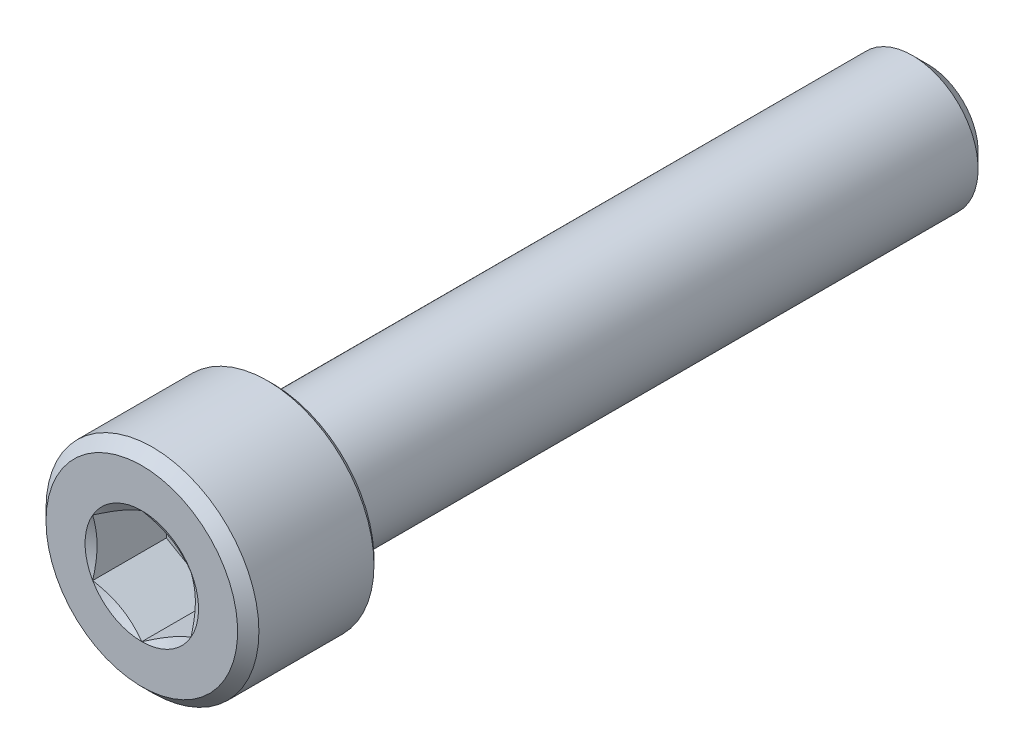
ISO-10303-21;
HEADER;
FILE_DESCRIPTION(('STEP AP214'),'2;1');
FILE_NAME('part.step','',(''),(''),'','','');
FILE_SCHEMA(('AUTOMOTIVE_DESIGN { 1 0 10303 214 1 1 1 1 }'));
ENDSEC;
DATA;
#1=APPLICATION_CONTEXT('core data for automotive mechanical design processes');
#2=APPLICATION_PROTOCOL_DEFINITION('international standard','automotive_design',2000,#1);
#3=PRODUCT_CONTEXT('',#1,'mechanical');
#4=PRODUCT('Part','Part','',(#3));
#5=PRODUCT_RELATED_PRODUCT_CATEGORY('part','',(#4));
#6=PRODUCT_DEFINITION_FORMATION('','',#4);
#7=PRODUCT_DEFINITION_CONTEXT('part definition',#1,'design');
#8=PRODUCT_DEFINITION('design','',#6,#7);
#9=PRODUCT_DEFINITION_SHAPE('','',#8);
#10=(LENGTH_UNIT() NAMED_UNIT(*) SI_UNIT(.MILLI.,.METRE.));
#11=(NAMED_UNIT(*) PLANE_ANGLE_UNIT() SI_UNIT($,.RADIAN.));
#12=(NAMED_UNIT(*) SI_UNIT($,.STERADIAN.) SOLID_ANGLE_UNIT());
#13=UNCERTAINTY_MEASURE_WITH_UNIT(LENGTH_MEASURE(1.E-05),#10,'distance_accuracy_value','');
#14=(GEOMETRIC_REPRESENTATION_CONTEXT(3) GLOBAL_UNCERTAINTY_ASSIGNED_CONTEXT((#13)) GLOBAL_UNIT_ASSIGNED_CONTEXT((#10,
#11,#12)) REPRESENTATION_CONTEXT('',''));
#15=CARTESIAN_POINT('',(0.,0.,0.));
#16=DIRECTION('',(0.,0.,1.));
#17=DIRECTION('',(1.,0.,0.));
#18=AXIS2_PLACEMENT_3D('',#15,#16,#17);
#19=CARTESIAN_POINT('',(-6.175,0.,16.));
#20=DIRECTION('',(0.,0.,-1.));
#21=DIRECTION('',(-1.,0.,0.));
#22=AXIS2_PLACEMENT_3D('',#19,#20,#21);
#23=PLANE('',#22);
#24=CARTESIAN_POINT('',(0.,0.,16.));
#25=DIRECTION('',(0.,0.,-1.));
#26=DIRECTION('',(-1.,0.,0.));
#27=AXIS2_PLACEMENT_3D('',#24,#25,#26);
#28=CIRCLE('',#27,4.);
#29=CARTESIAN_POINT('',(-4.,0.,16.));
#30=VERTEX_POINT('',#29);
#31=EDGE_CURVE('E12',#30,#30,#28,.T.);
#32=ORIENTED_EDGE('',*,*,#31,.F.);
#33=EDGE_LOOP('',(#32));
#34=FACE_BOUND('',#33,.T.);
#35=CARTESIAN_POINT('',(0.,0.,16.));
#36=DIRECTION('',(0.,0.,-1.));
#37=DIRECTION('',(-1.,0.,0.));
#38=AXIS2_PLACEMENT_3D('',#35,#36,#37);
#39=CIRCLE('',#38,6.175);
#40=CARTESIAN_POINT('',(-6.175,0.,16.));
#41=VERTEX_POINT('',#40);
#42=EDGE_CURVE('E286',#41,#41,#39,.T.);
#43=ORIENTED_EDGE('',*,*,#42,.T.);
#44=EDGE_LOOP('',(#43));
#45=FACE_BOUND('',#44,.T.);
#46=ADVANCED_FACE('F44',(#34,#45),#23,.T.);
#47=CARTESIAN_POINT('',(0.,0.,19.5));
#48=DIRECTION('',(0.,0.,1.));
#49=DIRECTION('',(1.,0.,0.));
#50=AXIS2_PLACEMENT_3D('',#47,#48,#49);
#51=PLANE('',#50);
#52=DIRECTION('',(-0.866025403784439,0.5,0.));
#53=VECTOR('',#52,1.);
#54=CARTESIAN_POINT('',(3.,1.73205080756887,19.5));
#55=LINE('',#54,#53);
#56=CARTESIAN_POINT('',(3.,1.73205080756887,19.5));
#57=VERTEX_POINT('',#56);
#58=CARTESIAN_POINT('',(0.,3.46410161513775,19.5));
#59=VERTEX_POINT('',#58);
#60=EDGE_CURVE('E113',#57,#59,#55,.T.);
#61=ORIENTED_EDGE('',*,*,#60,.T.);
#62=DIRECTION('',(-0.866025403784438,-0.5,0.));
#63=VECTOR('',#62,1.);
#64=CARTESIAN_POINT('',(0.,3.46410161513775,19.5));
#65=LINE('',#64,#63);
#66=CARTESIAN_POINT('',(-3.,1.73205080756887,19.5));
#67=VERTEX_POINT('',#66);
#68=EDGE_CURVE('E239',#59,#67,#65,.T.);
#69=ORIENTED_EDGE('',*,*,#68,.T.);
#70=DIRECTION('',(0.,-1.,0.));
#71=VECTOR('',#70,1.);
#72=CARTESIAN_POINT('',(-3.,1.73205080756887,19.5));
#73=LINE('',#72,#71);
#74=CARTESIAN_POINT('',(-3.,-1.73205080756888,19.5));
#75=VERTEX_POINT('',#74);
#76=EDGE_CURVE('E244',#67,#75,#73,.T.);
#77=ORIENTED_EDGE('',*,*,#76,.T.);
#78=DIRECTION('',(0.866025403784439,-0.5,0.));
#79=VECTOR('',#78,1.);
#80=CARTESIAN_POINT('',(-3.,-1.73205080756888,19.5));
#81=LINE('',#80,#79);
#82=CARTESIAN_POINT('',(0.,-3.46410161513776,19.5));
#83=VERTEX_POINT('',#82);
#84=EDGE_CURVE('E246',#75,#83,#81,.T.);
#85=ORIENTED_EDGE('',*,*,#84,.T.);
#86=DIRECTION('',(0.866025403784439,0.5,0.));
#87=VECTOR('',#86,1.);
#88=CARTESIAN_POINT('',(0.,-3.46410161513776,19.5));
#89=LINE('',#88,#87);
#90=CARTESIAN_POINT('',(3.,-1.73205080756888,19.5));
#91=VERTEX_POINT('',#90);
#92=EDGE_CURVE('E252',#83,#91,#89,.T.);
#93=ORIENTED_EDGE('',*,*,#92,.T.);
#94=DIRECTION('',(0.,1.,0.));
#95=VECTOR('',#94,1.);
#96=CARTESIAN_POINT('',(3.,-1.73205080756888,19.5));
#97=LINE('',#96,#95);
#98=EDGE_CURVE('E241',#91,#57,#97,.T.);
#99=ORIENTED_EDGE('',*,*,#98,.T.);
#100=EDGE_LOOP('',(#61,#69,#77,#85,#93,#99));
#101=FACE_BOUND('',#100,.T.);
#102=ADVANCED_FACE('F228',(#101),#51,.T.);
#103=CARTESIAN_POINT('',(0.,3.46410161513775,19.5));
#104=DIRECTION('',(-0.5,0.866025403784438,0.));
#105=DIRECTION('',(-0.866025403784439,-0.5,0.));
#106=AXIS2_PLACEMENT_3D('',#103,#104,#105);
#107=PLANE('',#106);
#108=DIRECTION('',(0.,0.,1.));
#109=VECTOR('',#108,1.);
#110=CARTESIAN_POINT('',(0.,3.46410161513775,19.5));
#111=LINE('',#110,#109);
#112=CARTESIAN_POINT('',(0.,3.46410161513775,24.));
#113=VERTEX_POINT('',#112);
#114=EDGE_CURVE('E67',#59,#113,#111,.T.);
#115=ORIENTED_EDGE('',*,*,#114,.T.);
#116=CARTESIAN_POINT('',(0.00019999999999905,3.46421708519159,24.0000666699999));
#117=CARTESIAN_POINT('',(-0.131635206588333,3.38810199317915,23.9561045120212));
#118=CARTESIAN_POINT('',(-0.26460840535525,3.31132988107606,23.9161223938615));
#119=CARTESIAN_POINT('',(-0.532857420002056,3.15645624025987,23.8463328880144));
#120=CARTESIAN_POINT('',(-0.668138002634341,3.07835195946099,23.8165501898343));
#121=CARTESIAN_POINT('',(-0.937022602096482,2.92311136358058,23.7701886467801));
#122=CARTESIAN_POINT('',(-1.07058524542946,2.84599893549861,23.7533012486918));
#123=CARTESIAN_POINT('',(-1.33833905729569,2.69141120014109,23.7331404500174));
#124=CARTESIAN_POINT('',(-1.47252925247984,2.61393645482891,23.72985035535));
#125=CARTESIAN_POINT('',(-1.72327559769581,2.46916798492016,23.7366913384543));
#126=CARTESIAN_POINT('',(-1.83986926497267,2.40185259973206,23.7451427217615));
#127=CARTESIAN_POINT('',(-2.07229698497464,2.26766039302179,23.7719297505759));
#128=CARTESIAN_POINT('',(-2.18813023365133,2.2007840357172,23.7902745484306));
#129=CARTESIAN_POINT('',(-2.42103725705637,2.06631510305814,23.8361355584222));
#130=CARTESIAN_POINT('',(-2.53808155051394,1.9987395487233,23.863846192832));
#131=CARTESIAN_POINT('',(-2.77042435049912,1.86459637060759,23.9267386027063));
#132=CARTESIAN_POINT('',(-2.88572583417111,1.7980270279716,23.9619055985904));
#133=CARTESIAN_POINT('',(-3.0002,1.73193533751503,24.0000666699999));
#134=B_SPLINE_CURVE_WITH_KNOTS('',3,(#116,#117,#118,#119,#120,#121,#122,#123,#124,#125,#126,
#127,#128,#129,#130,#131,#132,#133),.UNSPECIFIED.,.F.,.F.,(4,2,2,2,2,2,2,2,4),(0.,
0.47553983010304,0.952222784107962,1.41710776961288,1.88142182298026,2.28572436316091,
2.69040156475039,3.10405572063576,3.5168974940707),.UNSPECIFIED.);
#135=CARTESIAN_POINT('',(-3.,1.73205080756887,24.));
#136=VERTEX_POINT('',#135);
#137=EDGE_CURVE('E128',#113,#136,#134,.T.);
#138=ORIENTED_EDGE('',*,*,#137,.T.);
#139=DIRECTION('',(0.,0.,1.));
#140=VECTOR('',#139,1.);
#141=CARTESIAN_POINT('',(-3.,1.73205080756887,19.5));
#142=LINE('',#141,#140);
#143=EDGE_CURVE('E266',#67,#136,#142,.T.);
#144=ORIENTED_EDGE('',*,*,#143,.F.);
#145=ORIENTED_EDGE('',*,*,#68,.F.);
#146=EDGE_LOOP('',(#115,#138,#144,#145));
#147=FACE_BOUND('',#146,.T.);
#148=ADVANCED_FACE('F166',(#147),#107,.F.);
#149=CARTESIAN_POINT('',(-3.,1.73205080756887,19.5));
#150=DIRECTION('',(-1.,0.,0.));
#151=DIRECTION('',(0.,0.,1.));
#152=AXIS2_PLACEMENT_3D('',#149,#150,#151);
#153=PLANE('',#152);
#154=ORIENTED_EDGE('',*,*,#143,.T.);
#155=CARTESIAN_POINT('',(-3.,-4.48543536430121,25.1155058662184));
#156=CARTESIAN_POINT('',(-3.,-4.35588503052372,25.0533525182944));
#157=CARTESIAN_POINT('',(-3.,-4.22601909443386,24.9918447447347));
#158=CARTESIAN_POINT('',(-3.,-3.96548781431074,24.8704865718959));
#159=CARTESIAN_POINT('',(-3.,-3.83482233153596,24.8106364708305));
#160=CARTESIAN_POINT('',(-3.,-3.57177454799303,24.6926255104394));
#161=CARTESIAN_POINT('',(-3.,-3.43938664101575,24.6344771004077));
#162=CARTESIAN_POINT('',(-3.,-3.17349991024781,24.520787798694));
#163=CARTESIAN_POINT('',(-3.,-3.04000114460963,24.4652467715162));
#164=CARTESIAN_POINT('',(-3.,-2.76816374587128,24.3560522509139));
#165=CARTESIAN_POINT('',(-3.,-2.62978983048177,24.3024860760812));
#166=CARTESIAN_POINT('',(-3.,-2.35136827488079,24.1998072680353));
#167=CARTESIAN_POINT('',(-3.,-2.21132044281272,24.1506951509745));
#168=CARTESIAN_POINT('',(-3.,-1.92964550767154,24.0583268622198));
#169=CARTESIAN_POINT('',(-3.,-1.78802281189449,24.0150573953561));
#170=CARTESIAN_POINT('',(-3.,-1.5027602167832,23.9358603432606));
#171=CARTESIAN_POINT('',(-3.,-1.35912101283448,23.8999302904458));
#172=CARTESIAN_POINT('',(-3.,-1.07010604955885,23.8373211034103));
#173=CARTESIAN_POINT('',(-3.,-0.924734399405721,23.8106233691255));
#174=CARTESIAN_POINT('',(-3.,-0.632364701988075,23.7682292216072));
#175=CARTESIAN_POINT('',(-3.,-0.485366765313103,23.7525320649347));
#176=CARTESIAN_POINT('',(-3.,-0.192319677834093,23.7335954615372));
#177=CARTESIAN_POINT('',(-3.,-0.0462802617997357,23.7302090054289));
#178=CARTESIAN_POINT('',(-3.,0.245570293408266,23.7358029447781));
#179=CARTESIAN_POINT('',(-3.,0.391381417887333,23.7447841059913));
#180=CARTESIAN_POINT('',(-3.,0.643869100206319,23.7704392120639));
#181=CARTESIAN_POINT('',(-3.,0.750824764599158,23.7844927929994));
#182=CARTESIAN_POINT('',(-3.,0.963840268009906,23.818287437899));
#183=CARTESIAN_POINT('',(-3.,1.0698999603482,23.8380294152245));
#184=CARTESIAN_POINT('',(-3.,1.38665295522135,23.9047377007723));
#185=CARTESIAN_POINT('',(-3.,1.59578522307218,23.9591709581129));
#186=CARTESIAN_POINT('',(-3.,1.90847552506548,24.0521590645329));
#187=CARTESIAN_POINT('',(-3.,2.01368216267853,24.0854739198792));
#188=CARTESIAN_POINT('',(-3.,2.22307230618481,24.1552056022892));
#189=CARTESIAN_POINT('',(-3.,2.32725580472756,24.1916224516203));
#190=CARTESIAN_POINT('',(-3.,2.53464131390266,24.2670037780272));
#191=CARTESIAN_POINT('',(-3.,2.63784370218627,24.3059672252737));
#192=CARTESIAN_POINT('',(-3.,2.84341663884662,24.3860193804702));
#193=CARTESIAN_POINT('',(-3.,2.94578720091149,24.4271080533663));
#194=CARTESIAN_POINT('',(-3.,3.20710093082002,24.5346253511179));
#195=CARTESIAN_POINT('',(-3.,3.36552117789503,24.6023232629073));
#196=CARTESIAN_POINT('',(-3.,3.68093440750302,24.7409758527862));
#197=CARTESIAN_POINT('',(-3.,3.83792728242573,24.8119307740238));
#198=CARTESIAN_POINT('',(-3.,4.15079104589422,24.9563624607769));
#199=CARTESIAN_POINT('',(-3.,4.30666165721334,25.0298398251769));
#200=CARTESIAN_POINT('',(-3.,4.61746411737967,25.1787569256157));
#201=CARTESIAN_POINT('',(-3.,4.77239594525259,25.254196705301));
#202=CARTESIAN_POINT('',(-3.,5.23641467810939,25.4830040052947));
#203=CARTESIAN_POINT('',(-3.,5.54435835776794,25.638687771954));
#204=CARTESIAN_POINT('',(-3.,6.15813200085481,25.9540341937554));
#205=CARTESIAN_POINT('',(-3.,6.46396226135484,26.113696274533));
#206=CARTESIAN_POINT('',(-3.,7.04536657630952,26.4205840642052));
#207=CARTESIAN_POINT('',(-3.,7.32107199161348,26.5675613073177));
#208=CARTESIAN_POINT('',(-3.,7.87159754257052,26.8631899454703));
#209=CARTESIAN_POINT('',(-3.,8.14641764003882,27.0118414115106));
#210=CARTESIAN_POINT('',(-3.,8.6946763757738,27.3100196567772));
#211=CARTESIAN_POINT('',(-3.,8.96811674986234,27.459543247899));
#212=CARTESIAN_POINT('',(-3.,9.51444318928409,27.7595628050342));
#213=CARTESIAN_POINT('',(-3.,9.78732928570884,27.910058714409));
#214=CARTESIAN_POINT('',(-3.,10.060016784465,28.0609113094681));
#215=B_SPLINE_CURVE_WITH_KNOTS('',3,(#155,#156,#157,#158,#159,#160,#161,#162,#163,#164,#165,
#166,#167,#168,#169,#170,#171,#172,#173,#174,#175,#176,#177,#178,#179,#180,#181,#182,#183,#184,
#185,#186,#187,#188,#189,#190,#191,#192,#193,#194,#195,#196,#197,#198,#199,#200,#201,#202,#203,
#204,#205,#206,#207,#208,#209,#210,#211,#212,#213,#214),.UNSPECIFIED.,.F.,.F.,(4,2,2,2,2,2,2,2,
2,2,2,2,2,2,2,2,2,2,2,2,2,2,2,2,2,2,2,2,2,4),(0.,0.431071028294052,0.862219108681132,
1.29598254903029,1.72972342333,2.1748047551426,2.61993759885483,3.06403981300425,
3.50799246897818,3.95104542409342,4.39406843400064,4.83178333591775,5.26952534069158,
5.5929904594199,5.91650754452737,6.56394740096527,6.89499029059895,7.226035556789,
7.55694776874827,7.88785452430648,8.40463803639825,8.92146019125859,9.4384059116569,
9.95536313937712,10.9904914654607,12.0254712022289,12.9627691362888,13.9001069698815,
14.8350606497885,15.7699603501892),.UNSPECIFIED.);
#216=CARTESIAN_POINT('',(-3.,-1.73205080756888,24.));
#217=VERTEX_POINT('',#216);
#218=EDGE_CURVE('E136',#136,#217,#215,.F.);
#219=ORIENTED_EDGE('',*,*,#218,.T.);
#220=DIRECTION('',(0.,0.,1.));
#221=VECTOR('',#220,1.);
#222=CARTESIAN_POINT('',(-3.,-1.73205080756888,19.5));
#223=LINE('',#222,#221);
#224=EDGE_CURVE('E263',#75,#217,#223,.T.);
#225=ORIENTED_EDGE('',*,*,#224,.F.);
#226=ORIENTED_EDGE('',*,*,#76,.F.);
#227=EDGE_LOOP('',(#154,#219,#225,#226));
#228=FACE_BOUND('',#227,.T.);
#229=ADVANCED_FACE('F161',(#228),#153,.F.);
#230=CARTESIAN_POINT('',(-3.,-1.73205080756888,19.5));
#231=DIRECTION('',(-0.5,-0.866025403784439,0.));
#232=DIRECTION('',(0.866025403784439,-0.5,0.));
#233=AXIS2_PLACEMENT_3D('',#230,#231,#232);
#234=PLANE('',#233);
#235=ORIENTED_EDGE('',*,*,#224,.T.);
#236=CARTESIAN_POINT('',(-3.0002,-1.73193533751504,24.0000666699999));
#237=CARTESIAN_POINT('',(-2.86836479341167,-1.80805042952749,23.9561045120212));
#238=CARTESIAN_POINT('',(-2.73539159464475,-1.88482254163057,23.9161223938615));
#239=CARTESIAN_POINT('',(-2.46714257999794,-2.03969618244676,23.8463328880144));
#240=CARTESIAN_POINT('',(-2.33186199736566,-2.11780046324564,23.8165501898343));
#241=CARTESIAN_POINT('',(-2.06297739790352,-2.27304105912605,23.7701886467801));
#242=CARTESIAN_POINT('',(-1.92941475457054,-2.35015348720802,23.7533012486918));
#243=CARTESIAN_POINT('',(-1.66166094270431,-2.50474122256554,23.7331404500174));
#244=CARTESIAN_POINT('',(-1.52747074752016,-2.58221596787772,23.72985035535));
#245=CARTESIAN_POINT('',(-1.27672440230419,-2.72698443778647,23.7366913384543));
#246=CARTESIAN_POINT('',(-1.16013073502732,-2.79429982297457,23.7451427217615));
#247=CARTESIAN_POINT('',(-0.927703015025363,-2.92849202968484,23.7719297505759));
#248=CARTESIAN_POINT('',(-0.811869766348668,-2.99536838698943,23.7902745484306));
#249=CARTESIAN_POINT('',(-0.578962742943631,-3.12983731964849,23.8361355584222));
#250=CARTESIAN_POINT('',(-0.461918449486057,-3.19741287398333,23.863846192832));
#251=CARTESIAN_POINT('',(-0.229575649500873,-3.33155605209904,23.9267386027063));
#252=CARTESIAN_POINT('',(-0.114274165828892,-3.39812539473503,23.9619055985904));
#253=CARTESIAN_POINT('',(0.000200000000001612,-3.4642170851916,24.0000666699999));
#254=B_SPLINE_CURVE_WITH_KNOTS('',3,(#236,#237,#238,#239,#240,#241,#242,#243,#244,#245,#246,
#247,#248,#249,#250,#251,#252,#253),.UNSPECIFIED.,.F.,.F.,(4,2,2,2,2,2,2,2,4),(0.,
0.475539830103041,0.952222784107963,1.41710776961288,1.88142182298026,2.28572436316091,
2.69040156475039,3.10405572063576,3.5168974940707),.UNSPECIFIED.);
#255=CARTESIAN_POINT('',(0.,-3.46410161513776,24.));
#256=VERTEX_POINT('',#255);
#257=EDGE_CURVE('E141',#217,#256,#254,.T.);
#258=ORIENTED_EDGE('',*,*,#257,.T.);
#259=DIRECTION('',(0.,0.,1.));
#260=VECTOR('',#259,1.);
#261=CARTESIAN_POINT('',(0.,-3.46410161513776,19.5));
#262=LINE('',#261,#260);
#263=EDGE_CURVE('E259',#83,#256,#262,.T.);
#264=ORIENTED_EDGE('',*,*,#263,.F.);
#265=ORIENTED_EDGE('',*,*,#84,.F.);
#266=EDGE_LOOP('',(#235,#258,#264,#265));
#267=FACE_BOUND('',#266,.T.);
#268=ADVANCED_FACE('F165',(#267),#234,.F.);
#269=CARTESIAN_POINT('',(0.,-3.46410161513776,19.5));
#270=DIRECTION('',(0.5,-0.866025403784438,0.));
#271=DIRECTION('',(0.866025403784439,0.5,0.));
#272=AXIS2_PLACEMENT_3D('',#269,#270,#271);
#273=PLANE('',#272);
#274=ORIENTED_EDGE('',*,*,#263,.T.);
#275=CARTESIAN_POINT('',(-0.000199999999998245,-3.4642170851916,24.0000666699999));
#276=CARTESIAN_POINT('',(0.131635206588334,-3.38810199317915,23.9561045120212));
#277=CARTESIAN_POINT('',(0.264608405355251,-3.31132988107607,23.9161223938615));
#278=CARTESIAN_POINT('',(0.532857420002058,-3.15645624025988,23.8463328880144));
#279=CARTESIAN_POINT('',(0.668138002634344,-3.078351959461,23.8165501898343));
#280=CARTESIAN_POINT('',(0.937022602096485,-2.92311136358059,23.7701886467801));
#281=CARTESIAN_POINT('',(1.07058524542946,-2.84599893549862,23.7533012486918));
#282=CARTESIAN_POINT('',(1.33833905729569,-2.6914112001411,23.7331404500174));
#283=CARTESIAN_POINT('',(1.47252925247984,-2.61393645482892,23.72985035535));
#284=CARTESIAN_POINT('',(1.72327559769581,-2.46916798492017,23.7366913384543));
#285=CARTESIAN_POINT('',(1.83986926497268,-2.40185259973206,23.7451427217615));
#286=CARTESIAN_POINT('',(2.07229698497464,-2.2676603930218,23.7719297505759));
#287=CARTESIAN_POINT('',(2.18813023365133,-2.2007840357172,23.7902745484306));
#288=CARTESIAN_POINT('',(2.42103725705637,-2.06631510305815,23.8361355584222));
#289=CARTESIAN_POINT('',(2.53808155051394,-1.99873954872331,23.863846192832));
#290=CARTESIAN_POINT('',(2.77042435049912,-1.86459637060759,23.9267386027063));
#291=CARTESIAN_POINT('',(2.88572583417111,-1.79802702797161,23.9619055985904));
#292=CARTESIAN_POINT('',(3.0002,-1.73193533751504,24.0000666699999));
#293=B_SPLINE_CURVE_WITH_KNOTS('',3,(#275,#276,#277,#278,#279,#280,#281,#282,#283,#284,#285,
#286,#287,#288,#289,#290,#291,#292),.UNSPECIFIED.,.F.,.F.,(4,2,2,2,2,2,2,2,4),(0.,
0.475539830103042,0.952222784107964,1.41710776961288,1.88142182298026,2.28572436316091,
2.69040156475039,3.10405572063576,3.5168974940707),.UNSPECIFIED.);
#294=CARTESIAN_POINT('',(3.,-1.73205080756888,24.));
#295=VERTEX_POINT('',#294);
#296=EDGE_CURVE('E122',#256,#295,#293,.T.);
#297=ORIENTED_EDGE('',*,*,#296,.T.);
#298=DIRECTION('',(0.,0.,1.));
#299=VECTOR('',#298,1.);
#300=CARTESIAN_POINT('',(3.,-1.73205080756888,19.5));
#301=LINE('',#300,#299);
#302=EDGE_CURVE('E119',#91,#295,#301,.T.);
#303=ORIENTED_EDGE('',*,*,#302,.F.);
#304=ORIENTED_EDGE('',*,*,#92,.F.);
#305=EDGE_LOOP('',(#274,#297,#303,#304));
#306=FACE_BOUND('',#305,.T.);
#307=ADVANCED_FACE('F172',(#306),#273,.F.);
#308=CARTESIAN_POINT('',(3.,-1.73205080756888,19.5));
#309=DIRECTION('',(1.,0.,0.));
#310=DIRECTION('',(0.,0.,-1.));
#311=AXIS2_PLACEMENT_3D('',#308,#309,#310);
#312=PLANE('',#311);
#313=ORIENTED_EDGE('',*,*,#302,.T.);
#314=CARTESIAN_POINT('',(3.,-4.48543536430121,25.1155058662184));
#315=CARTESIAN_POINT('',(3.,-4.35588503052372,25.0533525182944));
#316=CARTESIAN_POINT('',(3.,-4.22601909443386,24.9918447447347));
#317=CARTESIAN_POINT('',(3.,-3.96548781431074,24.8704865718959));
#318=CARTESIAN_POINT('',(3.,-3.83482233153596,24.8106364708305));
#319=CARTESIAN_POINT('',(3.,-3.57177454799303,24.6926255104394));
#320=CARTESIAN_POINT('',(3.,-3.43938664101575,24.6344771004077));
#321=CARTESIAN_POINT('',(3.,-3.1734999102478,24.520787798694));
#322=CARTESIAN_POINT('',(3.,-3.04000114460963,24.4652467715162));
#323=CARTESIAN_POINT('',(3.,-2.76816374587128,24.3560522509139));
#324=CARTESIAN_POINT('',(3.,-2.62978983048177,24.3024860760812));
#325=CARTESIAN_POINT('',(3.,-2.35136827488079,24.1998072680353));
#326=CARTESIAN_POINT('',(3.,-2.21132044281271,24.1506951509745));
#327=CARTESIAN_POINT('',(3.,-1.92964550767154,24.0583268622198));
#328=CARTESIAN_POINT('',(3.,-1.78802281189448,24.0150573953561));
#329=CARTESIAN_POINT('',(3.,-1.5027602167832,23.9358603432606));
#330=CARTESIAN_POINT('',(3.,-1.35912101283448,23.8999302904458));
#331=CARTESIAN_POINT('',(3.,-1.07010604955885,23.8373211034103));
#332=CARTESIAN_POINT('',(3.,-0.92473439940572,23.8106233691255));
#333=CARTESIAN_POINT('',(3.,-0.632364701988074,23.7682292216072));
#334=CARTESIAN_POINT('',(3.,-0.485366765313101,23.7525320649347));
#335=CARTESIAN_POINT('',(3.,-0.192319677834091,23.7335954615372));
#336=CARTESIAN_POINT('',(3.,-0.0462802617997347,23.7302090054289));
#337=CARTESIAN_POINT('',(3.,0.245570293408267,23.7358029447781));
#338=CARTESIAN_POINT('',(3.,0.391381417887334,23.7447841059913));
#339=CARTESIAN_POINT('',(3.,0.64386910020632,23.7704392120639));
#340=CARTESIAN_POINT('',(3.,0.750824764599159,23.7844927929994));
#341=CARTESIAN_POINT('',(3.,0.963840268009907,23.818287437899));
#342=CARTESIAN_POINT('',(3.,1.0698999603482,23.8380294152245));
#343=CARTESIAN_POINT('',(3.,1.38665295522135,23.9047377007723));
#344=CARTESIAN_POINT('',(3.,1.59578522307218,23.9591709581129));
#345=CARTESIAN_POINT('',(3.,1.90847552506548,24.0521590645329));
#346=CARTESIAN_POINT('',(3.,2.01368216267853,24.0854739198792));
#347=CARTESIAN_POINT('',(3.,2.22307230618481,24.1552056022892));
#348=CARTESIAN_POINT('',(3.,2.32725580472756,24.1916224516203));
#349=CARTESIAN_POINT('',(3.,2.53464131390266,24.2670037780272));
#350=CARTESIAN_POINT('',(3.,2.63784370218627,24.3059672252737));
#351=CARTESIAN_POINT('',(3.,2.84341663884662,24.3860193804702));
#352=CARTESIAN_POINT('',(3.,2.94578720091149,24.4271080533663));
#353=CARTESIAN_POINT('',(3.,3.20710093082002,24.5346253511179));
#354=CARTESIAN_POINT('',(3.,3.36552117789503,24.6023232629073));
#355=CARTESIAN_POINT('',(3.,3.68093440750302,24.7409758527862));
#356=CARTESIAN_POINT('',(3.,3.83792728242573,24.8119307740238));
#357=CARTESIAN_POINT('',(3.,4.15079104589422,24.9563624607769));
#358=CARTESIAN_POINT('',(3.,4.30666165721334,25.0298398251769));
#359=CARTESIAN_POINT('',(3.,4.61746411737967,25.1787569256157));
#360=CARTESIAN_POINT('',(3.,4.77239594525259,25.254196705301));
#361=CARTESIAN_POINT('',(3.,5.23641467810939,25.4830040052947));
#362=CARTESIAN_POINT('',(3.,5.54435835776794,25.638687771954));
#363=CARTESIAN_POINT('',(3.,6.15813200085481,25.9540341937554));
#364=CARTESIAN_POINT('',(3.,6.46396226135485,26.113696274533));
#365=CARTESIAN_POINT('',(3.,7.04536657630953,26.4205840642052));
#366=CARTESIAN_POINT('',(3.,7.32107199161348,26.5675613073177));
#367=CARTESIAN_POINT('',(3.,7.87159754257052,26.8631899454703));
#368=CARTESIAN_POINT('',(3.,8.14641764003882,27.0118414115106));
#369=CARTESIAN_POINT('',(3.,8.6946763757738,27.3100196567772));
#370=CARTESIAN_POINT('',(3.,8.96811674986234,27.459543247899));
#371=CARTESIAN_POINT('',(3.,9.51444318928409,27.7595628050342));
#372=CARTESIAN_POINT('',(3.,9.78732928570884,27.910058714409));
#373=CARTESIAN_POINT('',(3.,10.060016784465,28.0609113094681));
#374=B_SPLINE_CURVE_WITH_KNOTS('',3,(#314,#315,#316,#317,#318,#319,#320,#321,#322,#323,#324,
#325,#326,#327,#328,#329,#330,#331,#332,#333,#334,#335,#336,#337,#338,#339,#340,#341,#342,#343,
#344,#345,#346,#347,#348,#349,#350,#351,#352,#353,#354,#355,#356,#357,#358,#359,#360,#361,#362,
#363,#364,#365,#366,#367,#368,#369,#370,#371,#372,#373),.UNSPECIFIED.,.F.,.F.,(4,2,2,2,2,2,2,2,
2,2,2,2,2,2,2,2,2,2,2,2,2,2,2,2,2,2,2,2,2,4),(0.,0.431071028294053,0.862219108681132,
1.2959825490303,1.72972342333,2.1748047551426,2.61993759885483,3.06403981300425,
3.50799246897818,3.95104542409342,4.39406843400064,4.83178333591775,5.26952534069158,
5.5929904594199,5.91650754452737,6.56394740096527,6.89499029059895,7.226035556789,
7.55694776874827,7.88785452430648,8.40463803639825,8.92146019125859,9.4384059116569,
9.95536313937712,10.9904914654607,12.0254712022289,12.9627691362888,13.9001069698815,
14.8350606497885,15.7699603501892),.UNSPECIFIED.);
#375=CARTESIAN_POINT('',(3.,1.73205080756887,24.));
#376=VERTEX_POINT('',#375);
#377=EDGE_CURVE('E103',#295,#376,#374,.T.);
#378=ORIENTED_EDGE('',*,*,#377,.T.);
#379=DIRECTION('',(0.,0.,1.));
#380=VECTOR('',#379,1.);
#381=CARTESIAN_POINT('',(3.,1.73205080756887,19.5));
#382=LINE('',#381,#380);
#383=EDGE_CURVE('E118',#57,#376,#382,.T.);
#384=ORIENTED_EDGE('',*,*,#383,.F.);
#385=ORIENTED_EDGE('',*,*,#98,.F.);
#386=EDGE_LOOP('',(#313,#378,#384,#385));
#387=FACE_BOUND('',#386,.T.);
#388=ADVANCED_FACE('F116',(#387),#312,.F.);
#389=CARTESIAN_POINT('',(3.,1.73205080756887,19.5));
#390=DIRECTION('',(0.5,0.866025403784439,0.));
#391=DIRECTION('',(-0.866025403784439,0.5,0.));
#392=AXIS2_PLACEMENT_3D('',#389,#390,#391);
#393=PLANE('',#392);
#394=ORIENTED_EDGE('',*,*,#383,.T.);
#395=CARTESIAN_POINT('',(3.0002,1.73193533751504,24.0000666699999));
#396=CARTESIAN_POINT('',(2.86836479341167,1.80805042952748,23.9561045120212));
#397=CARTESIAN_POINT('',(2.73539159464475,1.88482254163057,23.9161223938615));
#398=CARTESIAN_POINT('',(2.46714257999794,2.03969618244675,23.8463328880144));
#399=CARTESIAN_POINT('',(2.33186199736566,2.11780046324563,23.8165501898343));
#400=CARTESIAN_POINT('',(2.06297739790352,2.27304105912604,23.7701886467801));
#401=CARTESIAN_POINT('',(1.92941475457054,2.35015348720801,23.7533012486918));
#402=CARTESIAN_POINT('',(1.66166094270431,2.50474122256553,23.7331404500174));
#403=CARTESIAN_POINT('',(1.52747074752016,2.58221596787771,23.72985035535));
#404=CARTESIAN_POINT('',(1.27672440230419,2.72698443778646,23.7366913384543));
#405=CARTESIAN_POINT('',(1.16013073502733,2.79429982297457,23.7451427217615));
#406=CARTESIAN_POINT('',(0.927703015025365,2.92849202968483,23.7719297505759));
#407=CARTESIAN_POINT('',(0.81186976634867,2.99536838698943,23.7902745484306));
#408=CARTESIAN_POINT('',(0.578962742943633,3.12983731964848,23.8361355584222));
#409=CARTESIAN_POINT('',(0.461918449486059,3.19741287398332,23.863846192832));
#410=CARTESIAN_POINT('',(0.229575649500875,3.33155605209904,23.9267386027063));
#411=CARTESIAN_POINT('',(0.114274165828893,3.39812539473502,23.9619055985904));
#412=CARTESIAN_POINT('',(-0.000200000000001007,3.46421708519159,24.0000666699999));
#413=B_SPLINE_CURVE_WITH_KNOTS('',3,(#395,#396,#397,#398,#399,#400,#401,#402,#403,#404,#405,
#406,#407,#408,#409,#410,#411,#412),.UNSPECIFIED.,.F.,.F.,(4,2,2,2,2,2,2,2,4),(0.,
0.475539830103041,0.952222784107962,1.41710776961288,1.88142182298026,2.28572436316091,
2.69040156475039,3.10405572063576,3.5168974940707),.UNSPECIFIED.);
#414=EDGE_CURVE('E109',#376,#113,#413,.T.);
#415=ORIENTED_EDGE('',*,*,#414,.T.);
#416=ORIENTED_EDGE('',*,*,#114,.F.);
#417=ORIENTED_EDGE('',*,*,#60,.F.);
#418=EDGE_LOOP('',(#394,#415,#416,#417));
#419=FACE_BOUND('',#418,.T.);
#420=ADVANCED_FACE('F124',(#419),#393,.F.);
#421=CARTESIAN_POINT('',(0.,0.,24.));
#422=DIRECTION('',(0.,0.,1.));
#423=DIRECTION('',(1.,0.,0.));
#424=AXIS2_PLACEMENT_3D('',#421,#422,#423);
#425=CONICAL_SURFACE('',#424,3.46410161513775,1.0471975511966);
#426=CARTESIAN_POINT('',(0.,0.,24.));
#427=DIRECTION('',(0.,0.,1.));
#428=DIRECTION('',(1.,0.,0.));
#429=AXIS2_PLACEMENT_3D('',#426,#427,#428);
#430=CIRCLE('',#429,3.46410161513775);
#431=EDGE_CURVE('E134',#113,#136,#430,.T.);
#432=ORIENTED_EDGE('',*,*,#431,.T.);
#433=ORIENTED_EDGE('',*,*,#137,.F.);
#434=EDGE_LOOP('',(#432,#433));
#435=FACE_BOUND('',#434,.T.);
#436=ADVANCED_FACE('F197',(#435),#425,.F.);
#437=EDGE_CURVE('E139',#136,#217,#430,.T.);
#438=ORIENTED_EDGE('',*,*,#437,.T.);
#439=ORIENTED_EDGE('',*,*,#218,.F.);
#440=EDGE_LOOP('',(#438,#439));
#441=FACE_BOUND('',#440,.T.);
#442=ADVANCED_FACE('F329',(#441),#425,.F.);
#443=EDGE_CURVE('E315',#217,#256,#430,.T.);
#444=ORIENTED_EDGE('',*,*,#443,.T.);
#445=ORIENTED_EDGE('',*,*,#257,.F.);
#446=EDGE_LOOP('',(#444,#445));
#447=FACE_BOUND('',#446,.T.);
#448=ADVANCED_FACE('F327',(#447),#425,.F.);
#449=EDGE_CURVE('E108',#256,#295,#430,.T.);
#450=ORIENTED_EDGE('',*,*,#449,.T.);
#451=ORIENTED_EDGE('',*,*,#296,.F.);
#452=EDGE_LOOP('',(#450,#451));
#453=FACE_BOUND('',#452,.T.);
#454=ADVANCED_FACE('F324',(#453),#425,.F.);
#455=EDGE_CURVE('E53',#295,#376,#430,.T.);
#456=ORIENTED_EDGE('',*,*,#455,.T.);
#457=ORIENTED_EDGE('',*,*,#377,.F.);
#458=EDGE_LOOP('',(#456,#457));
#459=FACE_BOUND('',#458,.T.);
#460=ADVANCED_FACE('F101',(#459),#425,.F.);
#461=EDGE_CURVE('E47',#376,#113,#430,.T.);
#462=ORIENTED_EDGE('',*,*,#461,.T.);
#463=ORIENTED_EDGE('',*,*,#414,.F.);
#464=EDGE_LOOP('',(#462,#463));
#465=FACE_BOUND('',#464,.T.);
#466=ADVANCED_FACE('F110',(#465),#425,.F.);
#467=CARTESIAN_POINT('',(0.,6.49999999999999,24.));
#468=DIRECTION('',(0.,0.,1.));
#469=DIRECTION('',(1.,0.,0.));
#470=AXIS2_PLACEMENT_3D('',#467,#468,#469);
#471=PLANE('',#470);
#472=CARTESIAN_POINT('',(0.,0.,24.));
#473=DIRECTION('',(0.,0.,1.));
#474=DIRECTION('',(1.,0.,0.));
#475=AXIS2_PLACEMENT_3D('',#472,#473,#474);
#476=CIRCLE('',#475,5.85);
#477=CARTESIAN_POINT('',(-5.85,0.,24.));
#478=VERTEX_POINT('',#477);
#479=EDGE_CURVE('E282',#478,#478,#476,.T.);
#480=ORIENTED_EDGE('',*,*,#479,.T.);
#481=EDGE_LOOP('',(#480));
#482=FACE_BOUND('',#481,.T.);
#483=ORIENTED_EDGE('',*,*,#461,.F.);
#484=ORIENTED_EDGE('',*,*,#455,.F.);
#485=ORIENTED_EDGE('',*,*,#449,.F.);
#486=ORIENTED_EDGE('',*,*,#443,.F.);
#487=ORIENTED_EDGE('',*,*,#437,.F.);
#488=ORIENTED_EDGE('',*,*,#431,.F.);
#489=EDGE_LOOP('',(#483,#484,#485,#486,#487,#488));
#490=FACE_BOUND('',#489,.T.);
#491=ADVANCED_FACE('F131',(#482,#490),#471,.T.);
#492=CARTESIAN_POINT('',(0.,0.,23.35));
#493=DIRECTION('',(0.,0.,-1.));
#494=DIRECTION('',(-1.,0.,0.));
#495=AXIS2_PLACEMENT_3D('',#492,#493,#494);
#496=CONICAL_SURFACE('',#495,6.5,0.78539816339745);
#497=CARTESIAN_POINT('',(0.,0.,23.35));
#498=DIRECTION('',(0.,0.,1.));
#499=DIRECTION('',(1.,0.,0.));
#500=AXIS2_PLACEMENT_3D('',#497,#498,#499);
#501=CIRCLE('',#500,6.5);
#502=CARTESIAN_POINT('',(-6.5,0.,23.35));
#503=VERTEX_POINT('',#502);
#504=EDGE_CURVE('E278',#503,#503,#501,.F.);
#505=CARTESIAN_POINT('',(-5.85,0.,24.));
#506=CARTESIAN_POINT('',(-5.85677083333333,0.,23.9932291666667));
#507=CARTESIAN_POINT('',(-5.86354166666667,0.,23.9864583333333));
#508=CARTESIAN_POINT('',(-5.87708333333333,0.,23.9729166666667));
#509=CARTESIAN_POINT('',(-5.88385416666667,0.,23.9661458333333));
#510=CARTESIAN_POINT('',(-5.89739583333333,0.,23.9526041666667));
#511=CARTESIAN_POINT('',(-5.90416666666667,0.,23.9458333333333));
#512=CARTESIAN_POINT('',(-5.91770833333333,0.,23.9322916666667));
#513=CARTESIAN_POINT('',(-5.92447916666667,0.,23.9255208333333));
#514=CARTESIAN_POINT('',(-5.93802083333333,0.,23.9119791666667));
#515=CARTESIAN_POINT('',(-5.94479166666667,0.,23.9052083333333));
#516=CARTESIAN_POINT('',(-5.95833333333333,0.,23.8916666666667));
#517=CARTESIAN_POINT('',(-5.96510416666667,0.,23.8848958333333));
#518=CARTESIAN_POINT('',(-5.97864583333333,0.,23.8713541666667));
#519=CARTESIAN_POINT('',(-5.98541666666667,0.,23.8645833333333));
#520=CARTESIAN_POINT('',(-5.99895833333333,0.,23.8510416666667));
#521=CARTESIAN_POINT('',(-6.00572916666667,0.,23.8442708333333));
#522=CARTESIAN_POINT('',(-6.01927083333333,0.,23.8307291666667));
#523=CARTESIAN_POINT('',(-6.02604166666667,0.,23.8239583333333));
#524=CARTESIAN_POINT('',(-6.03958333333333,0.,23.8104166666667));
#525=CARTESIAN_POINT('',(-6.04635416666667,0.,23.8036458333333));
#526=CARTESIAN_POINT('',(-6.05989583333333,0.,23.7901041666667));
#527=CARTESIAN_POINT('',(-6.06666666666667,0.,23.7833333333333));
#528=CARTESIAN_POINT('',(-6.08020833333333,0.,23.7697916666667));
#529=CARTESIAN_POINT('',(-6.08697916666667,0.,23.7630208333333));
#530=CARTESIAN_POINT('',(-6.10052083333333,0.,23.7494791666667));
#531=CARTESIAN_POINT('',(-6.10729166666667,0.,23.7427083333333));
#532=CARTESIAN_POINT('',(-6.12083333333333,0.,23.7291666666667));
#533=CARTESIAN_POINT('',(-6.12760416666667,0.,23.7223958333333));
#534=CARTESIAN_POINT('',(-6.14114583333333,0.,23.7088541666667));
#535=CARTESIAN_POINT('',(-6.14791666666667,0.,23.7020833333333));
#536=CARTESIAN_POINT('',(-6.16145833333333,0.,23.6885416666667));
#537=CARTESIAN_POINT('',(-6.16822916666667,0.,23.6817708333333));
#538=CARTESIAN_POINT('',(-6.18177083333333,0.,23.6682291666667));
#539=CARTESIAN_POINT('',(-6.18854166666667,0.,23.6614583333333));
#540=CARTESIAN_POINT('',(-6.20208333333333,0.,23.6479166666667));
#541=CARTESIAN_POINT('',(-6.20885416666667,0.,23.6411458333333));
#542=CARTESIAN_POINT('',(-6.22239583333333,0.,23.6276041666667));
#543=CARTESIAN_POINT('',(-6.22916666666667,0.,23.6208333333333));
#544=CARTESIAN_POINT('',(-6.24270833333333,0.,23.6072916666667));
#545=CARTESIAN_POINT('',(-6.24947916666667,0.,23.6005208333333));
#546=CARTESIAN_POINT('',(-6.26302083333333,0.,23.5869791666667));
#547=CARTESIAN_POINT('',(-6.26979166666667,0.,23.5802083333333));
#548=CARTESIAN_POINT('',(-6.28333333333333,0.,23.5666666666667));
#549=CARTESIAN_POINT('',(-6.29010416666667,0.,23.5598958333333));
#550=CARTESIAN_POINT('',(-6.30364583333333,0.,23.5463541666667));
#551=CARTESIAN_POINT('',(-6.31041666666667,0.,23.5395833333333));
#552=CARTESIAN_POINT('',(-6.32395833333333,0.,23.5260416666667));
#553=CARTESIAN_POINT('',(-6.33072916666667,0.,23.5192708333333));
#554=CARTESIAN_POINT('',(-6.34427083333333,0.,23.5057291666667));
#555=CARTESIAN_POINT('',(-6.35104166666667,0.,23.4989583333333));
#556=CARTESIAN_POINT('',(-6.36458333333333,0.,23.4854166666667));
#557=CARTESIAN_POINT('',(-6.37135416666667,0.,23.4786458333333));
#558=CARTESIAN_POINT('',(-6.38489583333333,0.,23.4651041666667));
#559=CARTESIAN_POINT('',(-6.39166666666667,0.,23.4583333333333));
#560=CARTESIAN_POINT('',(-6.40520833333333,0.,23.4447916666667));
#561=CARTESIAN_POINT('',(-6.41197916666667,0.,23.4380208333333));
#562=CARTESIAN_POINT('',(-6.42552083333333,0.,23.4244791666667));
#563=CARTESIAN_POINT('',(-6.43229166666667,0.,23.4177083333333));
#564=CARTESIAN_POINT('',(-6.44583333333333,0.,23.4041666666667));
#565=CARTESIAN_POINT('',(-6.45260416666667,0.,23.3973958333333));
#566=CARTESIAN_POINT('',(-6.46614583333333,0.,23.3838541666667));
#567=CARTESIAN_POINT('',(-6.47291666666666,0.,23.3770833333333));
#568=CARTESIAN_POINT('',(-6.48645833333333,0.,23.3635416666667));
#569=CARTESIAN_POINT('',(-6.49322916666666,0.,23.3567708333333));
#570=CARTESIAN_POINT('',(-6.5,0.,23.35));
#571=B_SPLINE_CURVE_WITH_KNOTS('',3,(#505,#506,#507,#508,#509,#510,#511,#512,#513,#514,#515,
#516,#517,#518,#519,#520,#521,#522,#523,#524,#525,#526,#527,#528,#529,#530,#531,#532,#533,#534,
#535,#536,#537,#538,#539,#540,#541,#542,#543,#544,#545,#546,#547,#548,#549,#550,#551,#552,#553,
#554,#555,#556,#557,#558,#559,#560,#561,#562,#563,#564,#565,#566,#567,#568,#569,#570),
.UNSPECIFIED.,.F.,.F.,(4,2,2,2,2,2,2,2,2,2,2,2,2,2,2,2,2,2,2,2,2,2,2,2,2,2,2,2,2,2,2,2,4),(0.,
0.028726212985704,0.0574524259714086,0.0861786389571108,0.114904851942815,0.143631064928519,
0.172357277914221,0.201083490899926,0.229809703885627,0.258535916871332,0.287262129857036,
0.315988342842738,0.344714555828443,0.373440768814147,0.402166981799849,0.430893194785553,
0.459619407771255,0.488345620756959,0.517071833742664,0.545798046728366,0.57452425971407,
0.603250472699775,0.631976685685476,0.660702898671181,0.689429111656882,0.718155324642587,
0.746881537628292,0.775607750613993,0.804333963599698,0.833060176585402,0.861786389571104,
0.890512602556808,0.91923881554251),.UNSPECIFIED.);
#572=EDGE_CURVE('BSEAM202',#478,#503,#571,.T.);
#573=ORIENTED_EDGE('',*,*,#479,.F.);
#574=ORIENTED_EDGE('',*,*,#504,.F.);
#575=ORIENTED_EDGE('',*,*,#572,.T.);
#576=ORIENTED_EDGE('',*,*,#572,.F.);
#577=EDGE_LOOP('',(#573,#575,#574,#576));
#578=FACE_BOUND('',#577,.T.);
#579=ADVANCED_FACE('F202',(#578),#496,.T.);
#580=CARTESIAN_POINT('',(0.,0.,-24.));
#581=DIRECTION('',(0.,0.,-1.));
#582=DIRECTION('',(-1.,0.,0.));
#583=AXIS2_PLACEMENT_3D('',#580,#581,#582);
#584=CYLINDRICAL_SURFACE('',#583,6.5);
#585=CARTESIAN_POINT('',(0.,0.,16.325));
#586=DIRECTION('',(0.,0.,-1.));
#587=DIRECTION('',(-1.,0.,0.));
#588=AXIS2_PLACEMENT_3D('',#585,#586,#587);
#589=CIRCLE('',#588,6.5);
#590=CARTESIAN_POINT('',(-6.5,0.,16.325));
#591=VERTEX_POINT('',#590);
#592=EDGE_CURVE('E290',#591,#591,#589,.F.);
#593=ORIENTED_EDGE('',*,*,#592,.T.);
#594=EDGE_LOOP('',(#593));
#595=FACE_BOUND('',#594,.T.);
#596=ORIENTED_EDGE('',*,*,#504,.T.);
#597=EDGE_LOOP('',(#596));
#598=FACE_BOUND('',#597,.T.);
#599=ADVANCED_FACE('F198',(#595,#598),#584,.T.);
#600=CARTESIAN_POINT('',(0.,0.,16.));
#601=DIRECTION('',(0.,0.,1.));
#602=DIRECTION('',(1.,0.,0.));
#603=AXIS2_PLACEMENT_3D('',#600,#601,#602);
#604=CONICAL_SURFACE('',#603,6.17500000000001,0.785398163397446);
#605=ORIENTED_EDGE('',*,*,#592,.F.);
#606=EDGE_LOOP('',(#605));
#607=FACE_BOUND('',#606,.T.);
#608=ORIENTED_EDGE('',*,*,#42,.F.);
#609=EDGE_LOOP('',(#608));
#610=FACE_BOUND('',#609,.T.);
#611=ADVANCED_FACE('F201',(#607,#610),#604,.T.);
#612=CARTESIAN_POINT('',(0.,0.,-24.));
#613=DIRECTION('',(0.,0.,-1.));
#614=DIRECTION('',(-1.,0.,0.));
#615=AXIS2_PLACEMENT_3D('',#612,#613,#614);
#616=CYLINDRICAL_SURFACE('',#615,4.);
#617=CARTESIAN_POINT('',(0.,0.,-23.0625));
#618=DIRECTION('',(0.,0.,-1.));
#619=DIRECTION('',(-1.,0.,0.));
#620=AXIS2_PLACEMENT_3D('',#617,#618,#619);
#621=CIRCLE('',#620,4.);
#622=CARTESIAN_POINT('',(-4.,0.,-23.0625));
#623=VERTEX_POINT('',#622);
#624=EDGE_CURVE('E298',#623,#623,#621,.T.);
#625=ORIENTED_EDGE('',*,*,#624,.F.);
#626=EDGE_LOOP('',(#625));
#627=FACE_BOUND('',#626,.T.);
#628=ORIENTED_EDGE('',*,*,#31,.T.);
#629=EDGE_LOOP('',(#628));
#630=FACE_BOUND('',#629,.T.);
#631=ADVANCED_FACE('F212',(#627,#630),#616,.T.);
#632=CARTESIAN_POINT('',(0.,0.,-23.0625));
#633=DIRECTION('',(0.,0.,1.));
#634=DIRECTION('',(1.,0.,0.));
#635=AXIS2_PLACEMENT_3D('',#632,#633,#634);
#636=CONICAL_SURFACE('',#635,4.,0.785398163397448);
#637=CARTESIAN_POINT('',(0.,0.,-24.));
#638=DIRECTION('',(0.,0.,-1.));
#639=DIRECTION('',(-1.,0.,0.));
#640=AXIS2_PLACEMENT_3D('',#637,#638,#639);
#641=CIRCLE('',#640,3.0625);
#642=CARTESIAN_POINT('',(-3.0625,0.,-24.));
#643=VERTEX_POINT('',#642);
#644=EDGE_CURVE('E293',#643,#643,#641,.T.);
#645=ORIENTED_EDGE('',*,*,#644,.F.);
#646=EDGE_LOOP('',(#645));
#647=FACE_BOUND('',#646,.T.);
#648=ORIENTED_EDGE('',*,*,#624,.T.);
#649=EDGE_LOOP('',(#648));
#650=FACE_BOUND('',#649,.T.);
#651=ADVANCED_FACE('F216',(#647,#650),#636,.T.);
#652=CARTESIAN_POINT('',(0.,3.99999999999999,-24.));
#653=DIRECTION('',(0.,0.,-1.));
#654=DIRECTION('',(-1.,0.,0.));
#655=AXIS2_PLACEMENT_3D('',#652,#653,#654);
#656=PLANE('',#655);
#657=ORIENTED_EDGE('',*,*,#644,.T.);
#658=EDGE_LOOP('',(#657));
#659=FACE_BOUND('',#658,.T.);
#660=ADVANCED_FACE('F218',(#659),#656,.T.);
#661=CLOSED_SHELL('',(#46,#102,#148,#229,#268,#307,#388,#420,#436,#442,#448,#454,#460,#466,#491,
#579,#599,#611,#631,#651,#660));
#662=MANIFOLD_SOLID_BREP('B2',#661);
#663=ADVANCED_BREP_SHAPE_REPRESENTATION('',(#18,#662),#14);
#664=SHAPE_DEFINITION_REPRESENTATION(#9,#663);
ENDSEC;
END-ISO-10303-21;
